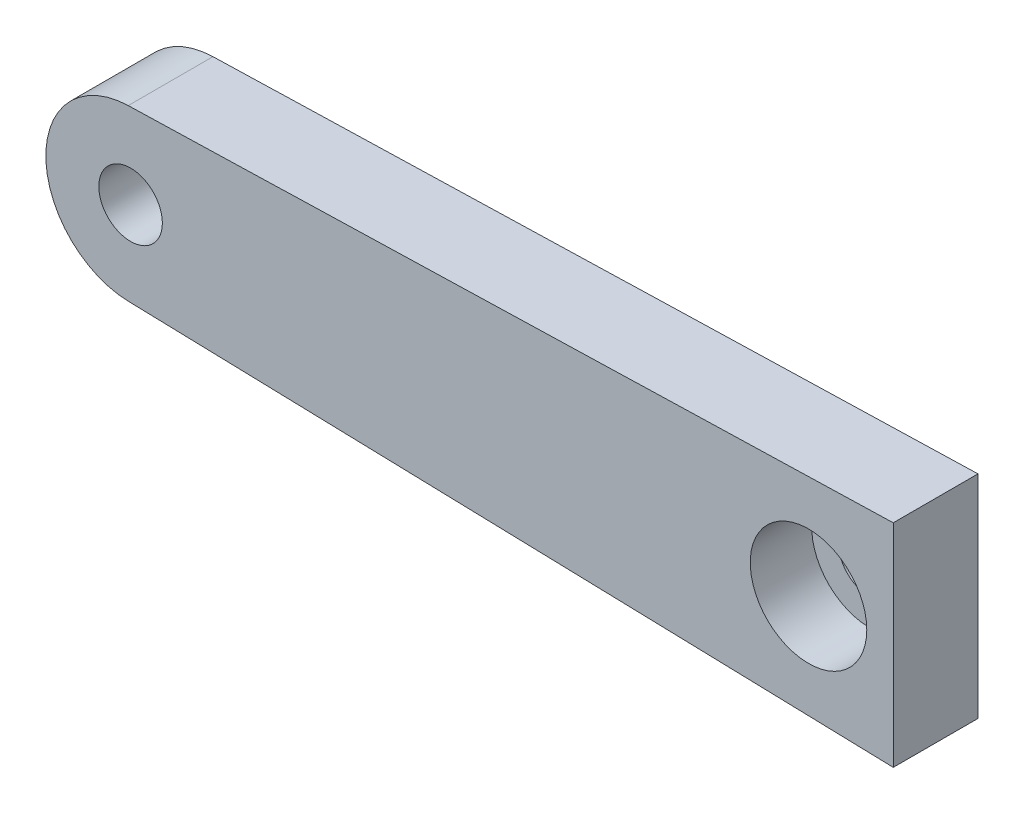
ISO-10303-21;
HEADER;
FILE_DESCRIPTION(('STEP AP214'),'2;1');
FILE_NAME('part.step','',(''),(''),'','','');
FILE_SCHEMA(('AUTOMOTIVE_DESIGN { 1 0 10303 214 1 1 1 1 }'));
ENDSEC;
DATA;
#1=APPLICATION_CONTEXT('core data for automotive mechanical design processes');
#2=APPLICATION_PROTOCOL_DEFINITION('international standard','automotive_design',2000,#1);
#3=PRODUCT_CONTEXT('',#1,'mechanical');
#4=PRODUCT('Part','Part','',(#3));
#5=PRODUCT_RELATED_PRODUCT_CATEGORY('part','',(#4));
#6=PRODUCT_DEFINITION_FORMATION('','',#4);
#7=PRODUCT_DEFINITION_CONTEXT('part definition',#1,'design');
#8=PRODUCT_DEFINITION('design','',#6,#7);
#9=PRODUCT_DEFINITION_SHAPE('','',#8);
#10=(LENGTH_UNIT() NAMED_UNIT(*) SI_UNIT(.MILLI.,.METRE.));
#11=(NAMED_UNIT(*) PLANE_ANGLE_UNIT() SI_UNIT($,.RADIAN.));
#12=(NAMED_UNIT(*) SI_UNIT($,.STERADIAN.) SOLID_ANGLE_UNIT());
#13=UNCERTAINTY_MEASURE_WITH_UNIT(LENGTH_MEASURE(1.E-05),#10,'distance_accuracy_value','');
#14=(GEOMETRIC_REPRESENTATION_CONTEXT(3) GLOBAL_UNCERTAINTY_ASSIGNED_CONTEXT((#13)) GLOBAL_UNIT_ASSIGNED_CONTEXT((#10,
#11,#12)) REPRESENTATION_CONTEXT('',''));
#15=CARTESIAN_POINT('',(0.,0.,0.));
#16=DIRECTION('',(0.,0.,1.));
#17=DIRECTION('',(1.,0.,0.));
#18=AXIS2_PLACEMENT_3D('',#15,#16,#17);
#19=CARTESIAN_POINT('',(0.,0.,4.));
#20=DIRECTION('',(0.,0.,-1.));
#21=DIRECTION('',(-1.,0.,0.));
#22=AXIS2_PLACEMENT_3D('',#19,#20,#21);
#23=CYLINDRICAL_SURFACE('',#22,1.5);
#24=CARTESIAN_POINT('',(0.,0.,0.));
#25=DIRECTION('',(0.,0.,1.));
#26=DIRECTION('',(1.,0.,0.));
#27=AXIS2_PLACEMENT_3D('',#24,#25,#26);
#28=CIRCLE('',#27,1.5);
#29=CARTESIAN_POINT('',(1.5,0.,0.));
#30=VERTEX_POINT('',#29);
#31=EDGE_CURVE('E104',#30,#30,#28,.T.);
#32=ORIENTED_EDGE('',*,*,#31,.F.);
#33=EDGE_LOOP('',(#32));
#34=FACE_BOUND('',#33,.T.);
#35=CARTESIAN_POINT('',(0.,0.,1.1));
#36=DIRECTION('',(0.,0.,1.));
#37=DIRECTION('',(1.,0.,0.));
#38=AXIS2_PLACEMENT_3D('',#35,#36,#37);
#39=CIRCLE('',#38,1.5);
#40=CARTESIAN_POINT('',(1.5,0.,1.1));
#41=VERTEX_POINT('',#40);
#42=EDGE_CURVE('E38',#41,#41,#39,.T.);
#43=ORIENTED_EDGE('',*,*,#42,.T.);
#44=EDGE_LOOP('',(#43));
#45=FACE_BOUND('',#44,.T.);
#46=ADVANCED_FACE('F34',(#34,#45),#23,.F.);
#47=CARTESIAN_POINT('',(-32.,0.,4.));
#48=DIRECTION('',(0.,0.,1.));
#49=DIRECTION('',(1.,0.,0.));
#50=AXIS2_PLACEMENT_3D('',#47,#48,#49);
#51=PLANE('',#50);
#52=CARTESIAN_POINT('',(0.,0.,4.));
#53=DIRECTION('',(0.,0.,1.));
#54=DIRECTION('',(1.,0.,0.));
#55=AXIS2_PLACEMENT_3D('',#52,#53,#54);
#56=CIRCLE('',#55,2.75);
#57=CARTESIAN_POINT('',(2.75,0.,4.));
#58=VERTEX_POINT('',#57);
#59=EDGE_CURVE('E124',#58,#58,#56,.T.);
#60=ORIENTED_EDGE('',*,*,#59,.F.);
#61=EDGE_LOOP('',(#60));
#62=FACE_BOUND('',#61,.T.);
#63=CARTESIAN_POINT('',(-32.,0.,4.));
#64=DIRECTION('',(0.,0.,1.));
#65=DIRECTION('',(1.,0.,0.));
#66=AXIS2_PLACEMENT_3D('',#63,#64,#65);
#67=CIRCLE('',#66,4.);
#68=CARTESIAN_POINT('',(-32.1108975584614,3.99846242092224,4.));
#69=VERTEX_POINT('',#68);
#70=CARTESIAN_POINT('',(-32.1108975584614,-3.99846242092224,4.));
#71=VERTEX_POINT('',#70);
#72=EDGE_CURVE('E88',#69,#71,#67,.T.);
#73=ORIENTED_EDGE('',*,*,#72,.T.);
#74=DIRECTION('',(0.999615605230559,-0.0277243896153553,0.));
#75=VECTOR('',#74,1.);
#76=CARTESIAN_POINT('',(-32.1108975584614,-3.99846242092224,4.));
#77=LINE('',#76,#75);
#78=CARTESIAN_POINT('',(3.99999999999999,-5.,4.));
#79=VERTEX_POINT('',#78);
#80=EDGE_CURVE('E82',#71,#79,#77,.T.);
#81=ORIENTED_EDGE('',*,*,#80,.T.);
#82=DIRECTION('',(0.,1.,0.));
#83=VECTOR('',#82,1.);
#84=CARTESIAN_POINT('',(4.,5.,4.));
#85=LINE('',#84,#83);
#86=CARTESIAN_POINT('',(4.,5.,4.));
#87=VERTEX_POINT('',#86);
#88=EDGE_CURVE('E86',#79,#87,#85,.T.);
#89=ORIENTED_EDGE('',*,*,#88,.T.);
#90=DIRECTION('',(-0.999615605230559,-0.0277243896153553,0.));
#91=VECTOR('',#90,1.);
#92=CARTESIAN_POINT('',(-32.1108975584614,3.99846242092224,4.));
#93=LINE('',#92,#91);
#94=EDGE_CURVE('E52',#87,#69,#93,.T.);
#95=ORIENTED_EDGE('',*,*,#94,.T.);
#96=EDGE_LOOP('',(#73,#81,#89,#95));
#97=FACE_BOUND('',#96,.T.);
#98=CARTESIAN_POINT('',(-32.,0.,4.));
#99=DIRECTION('',(0.,0.,1.));
#100=DIRECTION('',(1.,0.,0.));
#101=AXIS2_PLACEMENT_3D('',#98,#99,#100);
#102=CIRCLE('',#101,1.5);
#103=CARTESIAN_POINT('',(-30.5,0.,4.));
#104=VERTEX_POINT('',#103);
#105=EDGE_CURVE('E118',#104,#104,#102,.T.);
#106=ORIENTED_EDGE('',*,*,#105,.F.);
#107=EDGE_LOOP('',(#106));
#108=FACE_BOUND('',#107,.T.);
#109=ADVANCED_FACE('F83',(#62,#97,#108),#51,.T.);
#110=CARTESIAN_POINT('',(-32.,0.,0.));
#111=DIRECTION('',(0.,0.,1.));
#112=DIRECTION('',(1.,0.,0.));
#113=AXIS2_PLACEMENT_3D('',#110,#111,#112);
#114=PLANE('',#113);
#115=CARTESIAN_POINT('',(-32.,0.,0.));
#116=DIRECTION('',(0.,0.,1.));
#117=DIRECTION('',(1.,0.,0.));
#118=AXIS2_PLACEMENT_3D('',#115,#116,#117);
#119=CIRCLE('',#118,4.);
#120=CARTESIAN_POINT('',(-32.1108975584614,3.99846242092224,0.));
#121=VERTEX_POINT('',#120);
#122=CARTESIAN_POINT('',(-32.1108975584614,-3.99846242092224,0.));
#123=VERTEX_POINT('',#122);
#124=EDGE_CURVE('E101',#121,#123,#119,.T.);
#125=ORIENTED_EDGE('',*,*,#124,.F.);
#126=DIRECTION('',(-0.999615605230559,-0.0277243896153553,0.));
#127=VECTOR('',#126,1.);
#128=CARTESIAN_POINT('',(-32.1108975584614,3.99846242092224,0.));
#129=LINE('',#128,#127);
#130=CARTESIAN_POINT('',(4.,5.,0.));
#131=VERTEX_POINT('',#130);
#132=EDGE_CURVE('E75',#131,#121,#129,.T.);
#133=ORIENTED_EDGE('',*,*,#132,.F.);
#134=DIRECTION('',(0.,1.,0.));
#135=VECTOR('',#134,1.);
#136=CARTESIAN_POINT('',(4.,5.,0.));
#137=LINE('',#136,#135);
#138=CARTESIAN_POINT('',(3.99999999999999,-5.,0.));
#139=VERTEX_POINT('',#138);
#140=EDGE_CURVE('E69',#139,#131,#137,.T.);
#141=ORIENTED_EDGE('',*,*,#140,.F.);
#142=DIRECTION('',(0.999615605230559,-0.0277243896153553,0.));
#143=VECTOR('',#142,1.);
#144=CARTESIAN_POINT('',(-32.1108975584614,-3.99846242092224,0.));
#145=LINE('',#144,#143);
#146=EDGE_CURVE('E92',#123,#139,#145,.T.);
#147=ORIENTED_EDGE('',*,*,#146,.F.);
#148=EDGE_LOOP('',(#125,#133,#141,#147));
#149=FACE_BOUND('',#148,.T.);
#150=ORIENTED_EDGE('',*,*,#31,.T.);
#151=EDGE_LOOP('',(#150));
#152=FACE_BOUND('',#151,.T.);
#153=CARTESIAN_POINT('',(-32.,0.,0.));
#154=DIRECTION('',(0.,0.,1.));
#155=DIRECTION('',(1.,0.,0.));
#156=AXIS2_PLACEMENT_3D('',#153,#154,#155);
#157=CIRCLE('',#156,1.5);
#158=CARTESIAN_POINT('',(-30.5,0.,0.));
#159=VERTEX_POINT('',#158);
#160=EDGE_CURVE('E119',#159,#159,#157,.T.);
#161=ORIENTED_EDGE('',*,*,#160,.T.);
#162=EDGE_LOOP('',(#161));
#163=FACE_BOUND('',#162,.T.);
#164=ADVANCED_FACE('F112',(#149,#152,#163),#114,.F.);
#165=CARTESIAN_POINT('',(-32.,0.,4.));
#166=DIRECTION('',(0.,0.,-1.));
#167=DIRECTION('',(-1.,0.,0.));
#168=AXIS2_PLACEMENT_3D('',#165,#166,#167);
#169=CYLINDRICAL_SURFACE('',#168,4.);
#170=ORIENTED_EDGE('',*,*,#124,.T.);
#171=DIRECTION('',(0.,0.,-1.));
#172=VECTOR('',#171,1.);
#173=CARTESIAN_POINT('',(-32.1108975584614,-3.99846242092224,4.));
#174=LINE('',#173,#172);
#175=EDGE_CURVE('E11',#71,#123,#174,.T.);
#176=ORIENTED_EDGE('',*,*,#175,.F.);
#177=ORIENTED_EDGE('',*,*,#72,.F.);
#178=DIRECTION('',(0.,0.,-1.));
#179=VECTOR('',#178,1.);
#180=CARTESIAN_POINT('',(-32.1108975584614,3.99846242092224,4.));
#181=LINE('',#180,#179);
#182=EDGE_CURVE('E97',#69,#121,#181,.T.);
#183=ORIENTED_EDGE('',*,*,#182,.T.);
#184=EDGE_LOOP('',(#170,#176,#177,#183));
#185=FACE_BOUND('',#184,.T.);
#186=ADVANCED_FACE('F36',(#185),#169,.T.);
#187=CARTESIAN_POINT('',(-32.1108975584614,-3.99846242092224,4.));
#188=DIRECTION('',(0.0277243896153553,0.999615605230559,0.));
#189=DIRECTION('',(-0.999615605230559,0.0277243896153553,0.));
#190=AXIS2_PLACEMENT_3D('',#187,#188,#189);
#191=PLANE('',#190);
#192=ORIENTED_EDGE('',*,*,#146,.T.);
#193=DIRECTION('',(0.,0.,-1.));
#194=VECTOR('',#193,1.);
#195=CARTESIAN_POINT('',(3.99999999999999,-5.,4.));
#196=LINE('',#195,#194);
#197=EDGE_CURVE('E44',#79,#139,#196,.T.);
#198=ORIENTED_EDGE('',*,*,#197,.F.);
#199=ORIENTED_EDGE('',*,*,#80,.F.);
#200=ORIENTED_EDGE('',*,*,#175,.T.);
#201=EDGE_LOOP('',(#192,#198,#199,#200));
#202=FACE_BOUND('',#201,.T.);
#203=ADVANCED_FACE('F91',(#202),#191,.F.);
#204=CARTESIAN_POINT('',(4.,5.,4.));
#205=DIRECTION('',(-1.,0.,0.));
#206=DIRECTION('',(0.,-1.,0.));
#207=AXIS2_PLACEMENT_3D('',#204,#205,#206);
#208=PLANE('',#207);
#209=ORIENTED_EDGE('',*,*,#140,.T.);
#210=DIRECTION('',(0.,0.,-1.));
#211=VECTOR('',#210,1.);
#212=CARTESIAN_POINT('',(4.,5.,4.));
#213=LINE('',#212,#211);
#214=EDGE_CURVE('E93',#87,#131,#213,.T.);
#215=ORIENTED_EDGE('',*,*,#214,.F.);
#216=ORIENTED_EDGE('',*,*,#88,.F.);
#217=ORIENTED_EDGE('',*,*,#197,.T.);
#218=EDGE_LOOP('',(#209,#215,#216,#217));
#219=FACE_BOUND('',#218,.T.);
#220=ADVANCED_FACE('F95',(#219),#208,.F.);
#221=CARTESIAN_POINT('',(-32.1108975584614,3.99846242092224,4.));
#222=DIRECTION('',(0.0277243896153553,-0.999615605230559,0.));
#223=DIRECTION('',(0.999615605230559,0.0277243896153553,0.));
#224=AXIS2_PLACEMENT_3D('',#221,#222,#223);
#225=PLANE('',#224);
#226=ORIENTED_EDGE('',*,*,#132,.T.);
#227=ORIENTED_EDGE('',*,*,#182,.F.);
#228=ORIENTED_EDGE('',*,*,#94,.F.);
#229=ORIENTED_EDGE('',*,*,#214,.T.);
#230=EDGE_LOOP('',(#226,#227,#228,#229));
#231=FACE_BOUND('',#230,.T.);
#232=ADVANCED_FACE('F109',(#231),#225,.F.);
#233=CARTESIAN_POINT('',(-32.,0.,4.));
#234=DIRECTION('',(0.,0.,-1.));
#235=DIRECTION('',(-1.,0.,0.));
#236=AXIS2_PLACEMENT_3D('',#233,#234,#235);
#237=CYLINDRICAL_SURFACE('',#236,1.5);
#238=ORIENTED_EDGE('',*,*,#105,.T.);
#239=EDGE_LOOP('',(#238));
#240=FACE_BOUND('',#239,.T.);
#241=ORIENTED_EDGE('',*,*,#160,.F.);
#242=EDGE_LOOP('',(#241));
#243=FACE_BOUND('',#242,.T.);
#244=ADVANCED_FACE('F142',(#240,#243),#237,.F.);
#245=CARTESIAN_POINT('',(0.,0.,1.1));
#246=DIRECTION('',(0.,0.,1.));
#247=DIRECTION('',(1.,0.,0.));
#248=AXIS2_PLACEMENT_3D('',#245,#246,#247);
#249=CYLINDRICAL_SURFACE('',#248,2.75);
#250=CARTESIAN_POINT('',(0.,0.,1.1));
#251=DIRECTION('',(0.,0.,1.));
#252=DIRECTION('',(1.,0.,0.));
#253=AXIS2_PLACEMENT_3D('',#250,#251,#252);
#254=CIRCLE('',#253,2.75);
#255=CARTESIAN_POINT('',(2.75,0.,1.1));
#256=VERTEX_POINT('',#255);
#257=EDGE_CURVE('E127',#256,#256,#254,.T.);
#258=ORIENTED_EDGE('',*,*,#257,.F.);
#259=EDGE_LOOP('',(#258));
#260=FACE_BOUND('',#259,.T.);
#261=ORIENTED_EDGE('',*,*,#59,.T.);
#262=EDGE_LOOP('',(#261));
#263=FACE_BOUND('',#262,.T.);
#264=ADVANCED_FACE('F137',(#260,#263),#249,.F.);
#265=CARTESIAN_POINT('',(0.,0.,1.1));
#266=DIRECTION('',(0.,0.,1.));
#267=DIRECTION('',(1.,0.,0.));
#268=AXIS2_PLACEMENT_3D('',#265,#266,#267);
#269=PLANE('',#268);
#270=ORIENTED_EDGE('',*,*,#42,.F.);
#271=EDGE_LOOP('',(#270));
#272=FACE_BOUND('',#271,.T.);
#273=ORIENTED_EDGE('',*,*,#257,.T.);
#274=EDGE_LOOP('',(#273));
#275=FACE_BOUND('',#274,.T.);
#276=ADVANCED_FACE('F135',(#272,#275),#269,.T.);
#277=CLOSED_SHELL('',(#46,#109,#164,#186,#203,#220,#232,#244,#264,#276));
#278=MANIFOLD_SOLID_BREP('B2',#277);
#279=ADVANCED_BREP_SHAPE_REPRESENTATION('',(#18,#278),#14);
#280=SHAPE_DEFINITION_REPRESENTATION(#9,#279);
ENDSEC;
END-ISO-10303-21;
